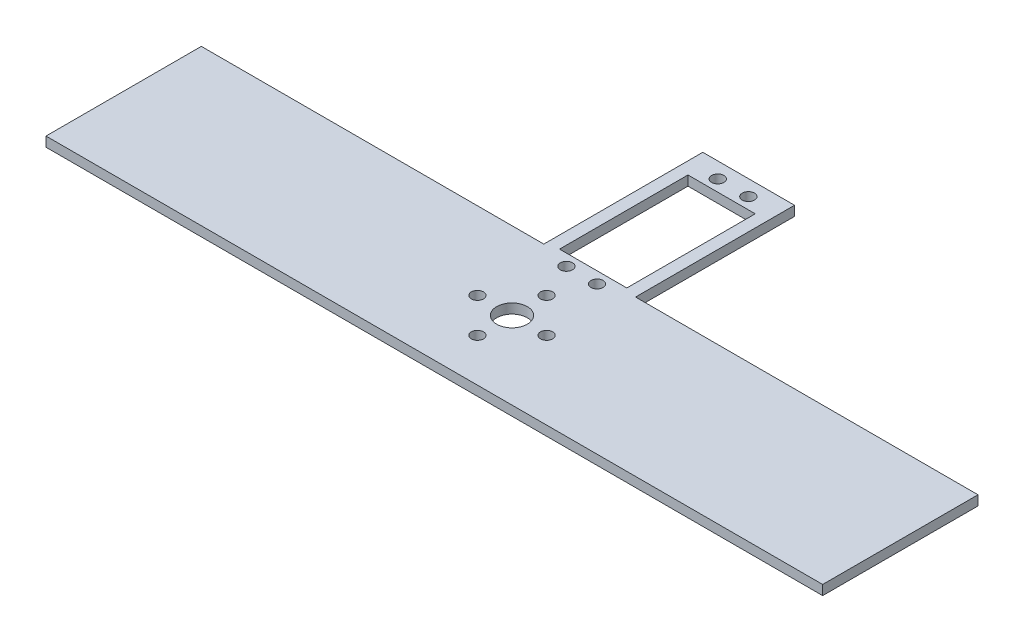
ISO-10303-21;
HEADER;
FILE_DESCRIPTION(('STEP AP214'),'2;1');
FILE_NAME('part.step','',(''),(''),'','','');
FILE_SCHEMA(('AUTOMOTIVE_DESIGN { 1 0 10303 214 1 1 1 1 }'));
ENDSEC;
DATA;
#1=APPLICATION_CONTEXT('core data for automotive mechanical design processes');
#2=APPLICATION_PROTOCOL_DEFINITION('international standard','automotive_design',2000,#1);
#3=PRODUCT_CONTEXT('',#1,'mechanical');
#4=PRODUCT('Part','Part','',(#3));
#5=PRODUCT_RELATED_PRODUCT_CATEGORY('part','',(#4));
#6=PRODUCT_DEFINITION_FORMATION('','',#4);
#7=PRODUCT_DEFINITION_CONTEXT('part definition',#1,'design');
#8=PRODUCT_DEFINITION('design','',#6,#7);
#9=PRODUCT_DEFINITION_SHAPE('','',#8);
#10=(LENGTH_UNIT() NAMED_UNIT(*) SI_UNIT(.MILLI.,.METRE.));
#11=(NAMED_UNIT(*) PLANE_ANGLE_UNIT() SI_UNIT($,.RADIAN.));
#12=(NAMED_UNIT(*) SI_UNIT($,.STERADIAN.) SOLID_ANGLE_UNIT());
#13=UNCERTAINTY_MEASURE_WITH_UNIT(LENGTH_MEASURE(1.E-05),#10,'distance_accuracy_value','');
#14=(GEOMETRIC_REPRESENTATION_CONTEXT(3) GLOBAL_UNCERTAINTY_ASSIGNED_CONTEXT((#13)) GLOBAL_UNIT_ASSIGNED_CONTEXT((#10,
#11,#12)) REPRESENTATION_CONTEXT('',''));
#15=CARTESIAN_POINT('',(0.,0.,0.));
#16=DIRECTION('',(0.,0.,1.));
#17=DIRECTION('',(1.,0.,0.));
#18=AXIS2_PLACEMENT_3D('',#15,#16,#17);
#19=CARTESIAN_POINT('',(0.,3.175,-1.1474067));
#20=DIRECTION('',(0.,0.,-1.));
#21=DIRECTION('',(-1.,0.,0.));
#22=AXIS2_PLACEMENT_3D('',#19,#20,#21);
#23=PLANE('',#22);
#24=DIRECTION('',(1.,0.,0.));
#25=VECTOR('',#24,1.);
#26=CARTESIAN_POINT('',(0.,0.,-1.1474067));
#27=LINE('',#26,#25);
#28=CARTESIAN_POINT('',(116.,0.,-1.1474067));
#29=VERTEX_POINT('',#28);
#30=CARTESIAN_POINT('',(138.,0.,-1.1474067));
#31=VERTEX_POINT('',#30);
#32=EDGE_CURVE('E207',#29,#31,#27,.T.);
#33=ORIENTED_EDGE('',*,*,#32,.F.);
#34=DIRECTION('',(0.,-1.,0.));
#35=VECTOR('',#34,1.);
#36=CARTESIAN_POINT('',(116.,3.175,-1.1474067));
#37=LINE('',#36,#35);
#38=CARTESIAN_POINT('',(116.,3.175,-1.1474067));
#39=VERTEX_POINT('',#38);
#40=EDGE_CURVE('E11',#39,#29,#37,.T.);
#41=ORIENTED_EDGE('',*,*,#40,.F.);
#42=DIRECTION('',(1.,0.,0.));
#43=VECTOR('',#42,1.);
#44=CARTESIAN_POINT('',(0.,3.175,-1.1474067));
#45=LINE('',#44,#43);
#46=CARTESIAN_POINT('',(138.,3.175,-1.1474067));
#47=VERTEX_POINT('',#46);
#48=EDGE_CURVE('E139',#39,#47,#45,.T.);
#49=ORIENTED_EDGE('',*,*,#48,.T.);
#50=DIRECTION('',(0.,-1.,0.));
#51=VECTOR('',#50,1.);
#52=CARTESIAN_POINT('',(138.,3.175,-1.1474067));
#53=LINE('',#52,#51);
#54=EDGE_CURVE('E54',#47,#31,#53,.T.);
#55=ORIENTED_EDGE('',*,*,#54,.T.);
#56=EDGE_LOOP('',(#33,#41,#49,#55));
#57=FACE_BOUND('',#56,.T.);
#58=ADVANCED_FACE('F35',(#57),#23,.T.);
#59=CARTESIAN_POINT('',(116.,3.175,0.));
#60=DIRECTION('',(-1.,0.,0.));
#61=DIRECTION('',(0.,0.,1.));
#62=AXIS2_PLACEMENT_3D('',#59,#60,#61);
#63=PLANE('',#62);
#64=DIRECTION('',(0.,0.,-1.));
#65=VECTOR('',#64,1.);
#66=CARTESIAN_POINT('',(116.,0.,0.));
#67=LINE('',#66,#65);
#68=CARTESIAN_POINT('',(116.,0.,-43.1474067));
#69=VERTEX_POINT('',#68);
#70=EDGE_CURVE('E145',#29,#69,#67,.T.);
#71=ORIENTED_EDGE('',*,*,#70,.T.);
#72=DIRECTION('',(0.,-1.,0.));
#73=VECTOR('',#72,1.);
#74=CARTESIAN_POINT('',(116.,3.175,-43.1474067));
#75=LINE('',#74,#73);
#76=CARTESIAN_POINT('',(116.,3.175,-43.1474067));
#77=VERTEX_POINT('',#76);
#78=EDGE_CURVE('E45',#77,#69,#75,.T.);
#79=ORIENTED_EDGE('',*,*,#78,.F.);
#80=DIRECTION('',(0.,0.,-1.));
#81=VECTOR('',#80,1.);
#82=CARTESIAN_POINT('',(116.,3.175,0.));
#83=LINE('',#82,#81);
#84=EDGE_CURVE('E132',#39,#77,#83,.T.);
#85=ORIENTED_EDGE('',*,*,#84,.F.);
#86=ORIENTED_EDGE('',*,*,#40,.T.);
#87=EDGE_LOOP('',(#71,#79,#85,#86));
#88=FACE_BOUND('',#87,.T.);
#89=ADVANCED_FACE('F143',(#88),#63,.F.);
#90=CARTESIAN_POINT('',(0.,3.175,-43.1474067));
#91=DIRECTION('',(0.,0.,1.));
#92=DIRECTION('',(1.,0.,0.));
#93=AXIS2_PLACEMENT_3D('',#90,#91,#92);
#94=PLANE('',#93);
#95=DIRECTION('',(-1.,0.,0.));
#96=VECTOR('',#95,1.);
#97=CARTESIAN_POINT('',(0.,0.,-43.1474067));
#98=LINE('',#97,#96);
#99=CARTESIAN_POINT('',(138.,0.,-43.1474067));
#100=VERTEX_POINT('',#99);
#101=EDGE_CURVE('E210',#100,#69,#98,.T.);
#102=ORIENTED_EDGE('',*,*,#101,.F.);
#103=DIRECTION('',(0.,-1.,0.));
#104=VECTOR('',#103,1.);
#105=CARTESIAN_POINT('',(138.,3.175,-43.1474067));
#106=LINE('',#105,#104);
#107=CARTESIAN_POINT('',(138.,3.175,-43.1474067));
#108=VERTEX_POINT('',#107);
#109=EDGE_CURVE('E91',#108,#100,#106,.T.);
#110=ORIENTED_EDGE('',*,*,#109,.F.);
#111=DIRECTION('',(-1.,0.,0.));
#112=VECTOR('',#111,1.);
#113=CARTESIAN_POINT('',(0.,3.175,-43.1474067));
#114=LINE('',#113,#112);
#115=EDGE_CURVE('E138',#108,#77,#114,.T.);
#116=ORIENTED_EDGE('',*,*,#115,.T.);
#117=ORIENTED_EDGE('',*,*,#78,.T.);
#118=EDGE_LOOP('',(#102,#110,#116,#117));
#119=FACE_BOUND('',#118,.T.);
#120=ADVANCED_FACE('F149',(#119),#94,.T.);
#121=CARTESIAN_POINT('',(112.,3.175,0.));
#122=DIRECTION('',(-1.,0.,0.));
#123=DIRECTION('',(0.,0.,1.));
#124=AXIS2_PLACEMENT_3D('',#121,#122,#123);
#125=PLANE('',#124);
#126=DIRECTION('',(0.,0.,-1.));
#127=VECTOR('',#126,1.);
#128=CARTESIAN_POINT('',(112.,0.,0.));
#129=LINE('',#128,#127);
#130=CARTESIAN_POINT('',(112.,0.,0.));
#131=VERTEX_POINT('',#130);
#132=CARTESIAN_POINT('',(112.,0.,-52.));
#133=VERTEX_POINT('',#132);
#134=EDGE_CURVE('E165',#131,#133,#129,.T.);
#135=ORIENTED_EDGE('',*,*,#134,.F.);
#136=DIRECTION('',(0.,-1.,0.));
#137=VECTOR('',#136,1.);
#138=CARTESIAN_POINT('',(112.,3.175,0.));
#139=LINE('',#138,#137);
#140=CARTESIAN_POINT('',(112.,3.175,0.));
#141=VERTEX_POINT('',#140);
#142=EDGE_CURVE('E39',#141,#131,#139,.T.);
#143=ORIENTED_EDGE('',*,*,#142,.F.);
#144=DIRECTION('',(0.,0.,-1.));
#145=VECTOR('',#144,1.);
#146=CARTESIAN_POINT('',(112.,3.175,0.));
#147=LINE('',#146,#145);
#148=CARTESIAN_POINT('',(112.,3.175,-52.));
#149=VERTEX_POINT('',#148);
#150=EDGE_CURVE('E262',#141,#149,#147,.T.);
#151=ORIENTED_EDGE('',*,*,#150,.T.);
#152=DIRECTION('',(0.,-1.,0.));
#153=VECTOR('',#152,1.);
#154=CARTESIAN_POINT('',(112.,3.175,-52.));
#155=LINE('',#154,#153);
#156=EDGE_CURVE('E158',#149,#133,#155,.T.);
#157=ORIENTED_EDGE('',*,*,#156,.T.);
#158=EDGE_LOOP('',(#135,#143,#151,#157));
#159=FACE_BOUND('',#158,.T.);
#160=ADVANCED_FACE('F242',(#159),#125,.T.);
#161=CARTESIAN_POINT('',(0.,3.175,0.));
#162=DIRECTION('',(0.,0.,-1.));
#163=DIRECTION('',(-1.,0.,0.));
#164=AXIS2_PLACEMENT_3D('',#161,#162,#163);
#165=PLANE('',#164);
#166=DIRECTION('',(1.,0.,0.));
#167=VECTOR('',#166,1.);
#168=CARTESIAN_POINT('',(0.,0.,0.));
#169=LINE('',#168,#167);
#170=CARTESIAN_POINT('',(0.,0.,0.));
#171=VERTEX_POINT('',#170);
#172=EDGE_CURVE('E168',#171,#131,#169,.T.);
#173=ORIENTED_EDGE('',*,*,#172,.F.);
#174=DIRECTION('',(0.,-1.,0.));
#175=VECTOR('',#174,1.);
#176=CARTESIAN_POINT('',(0.,3.175,0.));
#177=LINE('',#176,#175);
#178=CARTESIAN_POINT('',(0.,3.175,0.));
#179=VERTEX_POINT('',#178);
#180=EDGE_CURVE('E232',#179,#171,#177,.T.);
#181=ORIENTED_EDGE('',*,*,#180,.F.);
#182=DIRECTION('',(1.,0.,0.));
#183=VECTOR('',#182,1.);
#184=CARTESIAN_POINT('',(0.,3.175,0.));
#185=LINE('',#184,#183);
#186=EDGE_CURVE('E241',#179,#141,#185,.T.);
#187=ORIENTED_EDGE('',*,*,#186,.T.);
#188=ORIENTED_EDGE('',*,*,#142,.T.);
#189=EDGE_LOOP('',(#173,#181,#187,#188));
#190=FACE_BOUND('',#189,.T.);
#191=ADVANCED_FACE('F239',(#190),#165,.T.);
#192=CARTESIAN_POINT('',(0.,3.175,0.));
#193=DIRECTION('',(1.,0.,0.));
#194=DIRECTION('',(0.,0.,-1.));
#195=AXIS2_PLACEMENT_3D('',#192,#193,#194);
#196=PLANE('',#195);
#197=DIRECTION('',(0.,0.,1.));
#198=VECTOR('',#197,1.);
#199=CARTESIAN_POINT('',(0.,0.,0.));
#200=LINE('',#199,#198);
#201=CARTESIAN_POINT('',(0.,0.,50.8));
#202=VERTEX_POINT('',#201);
#203=EDGE_CURVE('E171',#171,#202,#200,.T.);
#204=ORIENTED_EDGE('',*,*,#203,.T.);
#205=DIRECTION('',(0.,-1.,0.));
#206=VECTOR('',#205,1.);
#207=CARTESIAN_POINT('',(0.,3.175,50.8));
#208=LINE('',#207,#206);
#209=CARTESIAN_POINT('',(0.,3.175,50.8));
#210=VERTEX_POINT('',#209);
#211=EDGE_CURVE('E230',#210,#202,#208,.T.);
#212=ORIENTED_EDGE('',*,*,#211,.F.);
#213=DIRECTION('',(0.,0.,1.));
#214=VECTOR('',#213,1.);
#215=CARTESIAN_POINT('',(0.,3.175,0.));
#216=LINE('',#215,#214);
#217=EDGE_CURVE('E250',#179,#210,#216,.T.);
#218=ORIENTED_EDGE('',*,*,#217,.F.);
#219=ORIENTED_EDGE('',*,*,#180,.T.);
#220=EDGE_LOOP('',(#204,#212,#218,#219));
#221=FACE_BOUND('',#220,.T.);
#222=ADVANCED_FACE('F248',(#221),#196,.F.);
#223=CARTESIAN_POINT('',(0.,3.175,50.8));
#224=DIRECTION('',(0.,0.,-1.));
#225=DIRECTION('',(-1.,0.,0.));
#226=AXIS2_PLACEMENT_3D('',#223,#224,#225);
#227=PLANE('',#226);
#228=DIRECTION('',(1.,0.,0.));
#229=VECTOR('',#228,1.);
#230=CARTESIAN_POINT('',(0.,0.,50.8));
#231=LINE('',#230,#229);
#232=CARTESIAN_POINT('',(254.,0.,50.8));
#233=VERTEX_POINT('',#232);
#234=EDGE_CURVE('E174',#202,#233,#231,.T.);
#235=ORIENTED_EDGE('',*,*,#234,.T.);
#236=DIRECTION('',(0.,-1.,0.));
#237=VECTOR('',#236,1.);
#238=CARTESIAN_POINT('',(254.,3.175,50.8));
#239=LINE('',#238,#237);
#240=CARTESIAN_POINT('',(254.,3.175,50.8));
#241=VERTEX_POINT('',#240);
#242=EDGE_CURVE('E228',#241,#233,#239,.T.);
#243=ORIENTED_EDGE('',*,*,#242,.F.);
#244=DIRECTION('',(1.,0.,0.));
#245=VECTOR('',#244,1.);
#246=CARTESIAN_POINT('',(0.,3.175,50.8));
#247=LINE('',#246,#245);
#248=EDGE_CURVE('E254',#210,#241,#247,.T.);
#249=ORIENTED_EDGE('',*,*,#248,.F.);
#250=ORIENTED_EDGE('',*,*,#211,.T.);
#251=EDGE_LOOP('',(#235,#243,#249,#250));
#252=FACE_BOUND('',#251,.T.);
#253=ADVANCED_FACE('F252',(#252),#227,.F.);
#254=CARTESIAN_POINT('',(254.,3.175,0.));
#255=DIRECTION('',(1.,0.,0.));
#256=DIRECTION('',(0.,0.,-1.));
#257=AXIS2_PLACEMENT_3D('',#254,#255,#256);
#258=PLANE('',#257);
#259=DIRECTION('',(0.,0.,1.));
#260=VECTOR('',#259,1.);
#261=CARTESIAN_POINT('',(254.,0.,0.));
#262=LINE('',#261,#260);
#263=CARTESIAN_POINT('',(254.,0.,0.));
#264=VERTEX_POINT('',#263);
#265=EDGE_CURVE('E177',#264,#233,#262,.T.);
#266=ORIENTED_EDGE('',*,*,#265,.F.);
#267=DIRECTION('',(0.,-1.,0.));
#268=VECTOR('',#267,1.);
#269=CARTESIAN_POINT('',(254.,3.175,0.));
#270=LINE('',#269,#268);
#271=CARTESIAN_POINT('',(254.,3.175,0.));
#272=VERTEX_POINT('',#271);
#273=EDGE_CURVE('E226',#272,#264,#270,.T.);
#274=ORIENTED_EDGE('',*,*,#273,.F.);
#275=DIRECTION('',(0.,0.,1.));
#276=VECTOR('',#275,1.);
#277=CARTESIAN_POINT('',(254.,3.175,0.));
#278=LINE('',#277,#276);
#279=EDGE_CURVE('E258',#272,#241,#278,.T.);
#280=ORIENTED_EDGE('',*,*,#279,.T.);
#281=ORIENTED_EDGE('',*,*,#242,.T.);
#282=EDGE_LOOP('',(#266,#274,#280,#281));
#283=FACE_BOUND('',#282,.T.);
#284=ADVANCED_FACE('F343',(#283),#258,.T.);
#285=CARTESIAN_POINT('',(0.,3.175,0.));
#286=DIRECTION('',(0.,0.,-1.));
#287=DIRECTION('',(-1.,0.,0.));
#288=AXIS2_PLACEMENT_3D('',#285,#286,#287);
#289=PLANE('',#288);
#290=DIRECTION('',(1.,0.,0.));
#291=VECTOR('',#290,1.);
#292=CARTESIAN_POINT('',(0.,0.,0.));
#293=LINE('',#292,#291);
#294=CARTESIAN_POINT('',(142.,0.,0.));
#295=VERTEX_POINT('',#294);
#296=EDGE_CURVE('E180',#295,#264,#293,.T.);
#297=ORIENTED_EDGE('',*,*,#296,.F.);
#298=DIRECTION('',(0.,-1.,0.));
#299=VECTOR('',#298,1.);
#300=CARTESIAN_POINT('',(142.,3.175,0.));
#301=LINE('',#300,#299);
#302=CARTESIAN_POINT('',(142.,3.175,0.));
#303=VERTEX_POINT('',#302);
#304=EDGE_CURVE('E224',#303,#295,#301,.T.);
#305=ORIENTED_EDGE('',*,*,#304,.F.);
#306=DIRECTION('',(1.,0.,0.));
#307=VECTOR('',#306,1.);
#308=CARTESIAN_POINT('',(0.,3.175,0.));
#309=LINE('',#308,#307);
#310=EDGE_CURVE('E267',#303,#272,#309,.T.);
#311=ORIENTED_EDGE('',*,*,#310,.T.);
#312=ORIENTED_EDGE('',*,*,#273,.T.);
#313=EDGE_LOOP('',(#297,#305,#311,#312));
#314=FACE_BOUND('',#313,.T.);
#315=ADVANCED_FACE('F305',(#314),#289,.T.);
#316=CARTESIAN_POINT('',(142.,3.175,0.));
#317=DIRECTION('',(1.,0.,0.));
#318=DIRECTION('',(0.,0.,-1.));
#319=AXIS2_PLACEMENT_3D('',#316,#317,#318);
#320=PLANE('',#319);
#321=DIRECTION('',(0.,0.,1.));
#322=VECTOR('',#321,1.);
#323=CARTESIAN_POINT('',(142.,0.,0.));
#324=LINE('',#323,#322);
#325=CARTESIAN_POINT('',(142.,0.,-52.));
#326=VERTEX_POINT('',#325);
#327=EDGE_CURVE('E183',#326,#295,#324,.T.);
#328=ORIENTED_EDGE('',*,*,#327,.F.);
#329=DIRECTION('',(0.,-1.,0.));
#330=VECTOR('',#329,1.);
#331=CARTESIAN_POINT('',(142.,3.175,-52.));
#332=LINE('',#331,#330);
#333=CARTESIAN_POINT('',(142.,3.175,-52.));
#334=VERTEX_POINT('',#333);
#335=EDGE_CURVE('E222',#334,#326,#332,.T.);
#336=ORIENTED_EDGE('',*,*,#335,.F.);
#337=DIRECTION('',(0.,0.,1.));
#338=VECTOR('',#337,1.);
#339=CARTESIAN_POINT('',(142.,3.175,0.));
#340=LINE('',#339,#338);
#341=EDGE_CURVE('E270',#334,#303,#340,.T.);
#342=ORIENTED_EDGE('',*,*,#341,.T.);
#343=ORIENTED_EDGE('',*,*,#304,.T.);
#344=EDGE_LOOP('',(#328,#336,#342,#343));
#345=FACE_BOUND('',#344,.T.);
#346=ADVANCED_FACE('F296',(#345),#320,.T.);
#347=CARTESIAN_POINT('',(138.,3.175,0.));
#348=DIRECTION('',(-1.,0.,0.));
#349=DIRECTION('',(0.,0.,1.));
#350=AXIS2_PLACEMENT_3D('',#347,#348,#349);
#351=PLANE('',#350);
#352=DIRECTION('',(0.,0.,-1.));
#353=VECTOR('',#352,1.);
#354=CARTESIAN_POINT('',(138.,0.,0.));
#355=LINE('',#354,#353);
#356=EDGE_CURVE('E212',#31,#100,#355,.T.);
#357=ORIENTED_EDGE('',*,*,#356,.F.);
#358=ORIENTED_EDGE('',*,*,#54,.F.);
#359=DIRECTION('',(0.,0.,-1.));
#360=VECTOR('',#359,1.);
#361=CARTESIAN_POINT('',(138.,3.175,0.));
#362=LINE('',#361,#360);
#363=EDGE_CURVE('E150',#47,#108,#362,.T.);
#364=ORIENTED_EDGE('',*,*,#363,.T.);
#365=ORIENTED_EDGE('',*,*,#109,.T.);
#366=EDGE_LOOP('',(#357,#358,#364,#365));
#367=FACE_BOUND('',#366,.T.);
#368=ADVANCED_FACE('F293',(#367),#351,.T.);
#369=CARTESIAN_POINT('',(132.,3.175,-46.8974067));
#370=DIRECTION('',(0.,-1.,0.));
#371=DIRECTION('',(0.,0.,-1.));
#372=AXIS2_PLACEMENT_3D('',#369,#370,#371);
#373=CYLINDRICAL_SURFACE('',#372,2.);
#374=CARTESIAN_POINT('',(132.,3.175,-46.8974067));
#375=DIRECTION('',(0.,1.,0.));
#376=DIRECTION('',(0.,0.,1.));
#377=AXIS2_PLACEMENT_3D('',#374,#375,#376);
#378=CIRCLE('',#377,2.);
#379=CARTESIAN_POINT('',(132.,3.175,-44.8974067));
#380=VERTEX_POINT('',#379);
#381=EDGE_CURVE('E291',#380,#380,#378,.T.);
#382=ORIENTED_EDGE('',*,*,#381,.T.);
#383=EDGE_LOOP('',(#382));
#384=FACE_BOUND('',#383,.T.);
#385=CARTESIAN_POINT('',(132.,0.,-46.8974067));
#386=DIRECTION('',(0.,1.,0.));
#387=DIRECTION('',(0.,0.,1.));
#388=AXIS2_PLACEMENT_3D('',#385,#386,#387);
#389=CIRCLE('',#388,2.);
#390=CARTESIAN_POINT('',(132.,0.,-44.8974067));
#391=VERTEX_POINT('',#390);
#392=EDGE_CURVE('E204',#391,#391,#389,.T.);
#393=ORIENTED_EDGE('',*,*,#392,.F.);
#394=EDGE_LOOP('',(#393));
#395=FACE_BOUND('',#394,.T.);
#396=ADVANCED_FACE('F295',(#384,#395),#373,.F.);
#397=CARTESIAN_POINT('',(122.,3.175,2.6025933));
#398=DIRECTION('',(0.,-1.,0.));
#399=DIRECTION('',(0.,0.,-1.));
#400=AXIS2_PLACEMENT_3D('',#397,#398,#399);
#401=CYLINDRICAL_SURFACE('',#400,2.);
#402=CARTESIAN_POINT('',(122.,3.175,2.6025933));
#403=DIRECTION('',(0.,1.,0.));
#404=DIRECTION('',(0.,0.,1.));
#405=AXIS2_PLACEMENT_3D('',#402,#403,#404);
#406=CIRCLE('',#405,2.);
#407=CARTESIAN_POINT('',(122.,3.175,4.6025933));
#408=VERTEX_POINT('',#407);
#409=EDGE_CURVE('E288',#408,#408,#406,.T.);
#410=ORIENTED_EDGE('',*,*,#409,.T.);
#411=EDGE_LOOP('',(#410));
#412=FACE_BOUND('',#411,.T.);
#413=CARTESIAN_POINT('',(122.,0.,2.6025933));
#414=DIRECTION('',(0.,1.,0.));
#415=DIRECTION('',(0.,0.,1.));
#416=AXIS2_PLACEMENT_3D('',#413,#414,#415);
#417=CIRCLE('',#416,2.);
#418=CARTESIAN_POINT('',(122.,0.,4.6025933));
#419=VERTEX_POINT('',#418);
#420=EDGE_CURVE('E201',#419,#419,#417,.T.);
#421=ORIENTED_EDGE('',*,*,#420,.F.);
#422=EDGE_LOOP('',(#421));
#423=FACE_BOUND('',#422,.T.);
#424=ADVANCED_FACE('F302',(#412,#423),#401,.F.);
#425=CARTESIAN_POINT('',(132.,3.175,2.6025933));
#426=DIRECTION('',(0.,-1.,0.));
#427=DIRECTION('',(0.,0.,-1.));
#428=AXIS2_PLACEMENT_3D('',#425,#426,#427);
#429=CYLINDRICAL_SURFACE('',#428,2.);
#430=CARTESIAN_POINT('',(132.,3.175,2.6025933));
#431=DIRECTION('',(0.,1.,0.));
#432=DIRECTION('',(0.,0.,1.));
#433=AXIS2_PLACEMENT_3D('',#430,#431,#432);
#434=CIRCLE('',#433,2.);
#435=CARTESIAN_POINT('',(132.,3.175,4.6025933));
#436=VERTEX_POINT('',#435);
#437=EDGE_CURVE('E285',#436,#436,#434,.T.);
#438=ORIENTED_EDGE('',*,*,#437,.T.);
#439=EDGE_LOOP('',(#438));
#440=FACE_BOUND('',#439,.T.);
#441=CARTESIAN_POINT('',(132.,0.,2.6025933));
#442=DIRECTION('',(0.,1.,0.));
#443=DIRECTION('',(0.,0.,1.));
#444=AXIS2_PLACEMENT_3D('',#441,#442,#443);
#445=CIRCLE('',#444,2.);
#446=CARTESIAN_POINT('',(132.,0.,4.6025933));
#447=VERTEX_POINT('',#446);
#448=EDGE_CURVE('E198',#447,#447,#445,.T.);
#449=ORIENTED_EDGE('',*,*,#448,.F.);
#450=EDGE_LOOP('',(#449));
#451=FACE_BOUND('',#450,.T.);
#452=ADVANCED_FACE('F319',(#440,#451),#429,.F.);
#453=CARTESIAN_POINT('',(127.,3.175,36.7137084989848));
#454=DIRECTION('',(0.,-1.,0.));
#455=DIRECTION('',(0.,0.,-1.));
#456=AXIS2_PLACEMENT_3D('',#453,#454,#455);
#457=CYLINDRICAL_SURFACE('',#456,2.);
#458=CARTESIAN_POINT('',(127.,3.175,36.7137084989848));
#459=DIRECTION('',(0.,1.,0.));
#460=DIRECTION('',(0.,0.,1.));
#461=AXIS2_PLACEMENT_3D('',#458,#459,#460);
#462=CIRCLE('',#461,2.);
#463=CARTESIAN_POINT('',(127.,3.175,38.7137084989848));
#464=VERTEX_POINT('',#463);
#465=EDGE_CURVE('E282',#464,#464,#462,.T.);
#466=ORIENTED_EDGE('',*,*,#465,.T.);
#467=EDGE_LOOP('',(#466));
#468=FACE_BOUND('',#467,.T.);
#469=CARTESIAN_POINT('',(127.,0.,36.7137084989848));
#470=DIRECTION('',(0.,1.,0.));
#471=DIRECTION('',(0.,0.,1.));
#472=AXIS2_PLACEMENT_3D('',#469,#470,#471);
#473=CIRCLE('',#472,2.);
#474=CARTESIAN_POINT('',(127.,0.,38.7137084989848));
#475=VERTEX_POINT('',#474);
#476=EDGE_CURVE('E195',#475,#475,#473,.T.);
#477=ORIENTED_EDGE('',*,*,#476,.F.);
#478=EDGE_LOOP('',(#477));
#479=FACE_BOUND('',#478,.T.);
#480=ADVANCED_FACE('F323',(#468,#479),#457,.F.);
#481=CARTESIAN_POINT('',(138.313708498985,3.175,25.4));
#482=DIRECTION('',(0.,-1.,0.));
#483=DIRECTION('',(0.,0.,-1.));
#484=AXIS2_PLACEMENT_3D('',#481,#482,#483);
#485=CYLINDRICAL_SURFACE('',#484,2.);
#486=CARTESIAN_POINT('',(138.313708498985,3.175,25.4));
#487=DIRECTION('',(0.,1.,0.));
#488=DIRECTION('',(0.,0.,1.));
#489=AXIS2_PLACEMENT_3D('',#486,#487,#488);
#490=CIRCLE('',#489,2.);
#491=CARTESIAN_POINT('',(138.313708498985,3.175,27.4));
#492=VERTEX_POINT('',#491);
#493=EDGE_CURVE('E279',#492,#492,#490,.T.);
#494=ORIENTED_EDGE('',*,*,#493,.T.);
#495=EDGE_LOOP('',(#494));
#496=FACE_BOUND('',#495,.T.);
#497=CARTESIAN_POINT('',(138.313708498985,0.,25.4));
#498=DIRECTION('',(0.,1.,0.));
#499=DIRECTION('',(0.,0.,1.));
#500=AXIS2_PLACEMENT_3D('',#497,#498,#499);
#501=CIRCLE('',#500,2.);
#502=CARTESIAN_POINT('',(138.313708498985,0.,27.4));
#503=VERTEX_POINT('',#502);
#504=EDGE_CURVE('E192',#503,#503,#501,.T.);
#505=ORIENTED_EDGE('',*,*,#504,.F.);
#506=EDGE_LOOP('',(#505));
#507=FACE_BOUND('',#506,.T.);
#508=ADVANCED_FACE('F327',(#496,#507),#485,.F.);
#509=CARTESIAN_POINT('',(127.,3.175,25.4));
#510=DIRECTION('',(0.,-1.,0.));
#511=DIRECTION('',(0.,0.,-1.));
#512=AXIS2_PLACEMENT_3D('',#509,#510,#511);
#513=CYLINDRICAL_SURFACE('',#512,4.99999999999999);
#514=CARTESIAN_POINT('',(127.,3.175,25.4));
#515=DIRECTION('',(0.,1.,0.));
#516=DIRECTION('',(0.,0.,1.));
#517=AXIS2_PLACEMENT_3D('',#514,#515,#516);
#518=CIRCLE('',#517,4.99999999999999);
#519=CARTESIAN_POINT('',(127.,3.175,30.4));
#520=VERTEX_POINT('',#519);
#521=EDGE_CURVE('E276',#520,#520,#518,.T.);
#522=ORIENTED_EDGE('',*,*,#521,.T.);
#523=EDGE_LOOP('',(#522));
#524=FACE_BOUND('',#523,.T.);
#525=CARTESIAN_POINT('',(127.,0.,25.4));
#526=DIRECTION('',(0.,1.,0.));
#527=DIRECTION('',(0.,0.,1.));
#528=AXIS2_PLACEMENT_3D('',#525,#526,#527);
#529=CIRCLE('',#528,4.99999999999999);
#530=CARTESIAN_POINT('',(127.,0.,30.4));
#531=VERTEX_POINT('',#530);
#532=EDGE_CURVE('E189',#531,#531,#529,.T.);
#533=ORIENTED_EDGE('',*,*,#532,.F.);
#534=EDGE_LOOP('',(#533));
#535=FACE_BOUND('',#534,.T.);
#536=ADVANCED_FACE('F331',(#524,#535),#513,.F.);
#537=CARTESIAN_POINT('',(0.,3.175,-52.));
#538=DIRECTION('',(0.,0.,-1.));
#539=DIRECTION('',(-1.,0.,0.));
#540=AXIS2_PLACEMENT_3D('',#537,#538,#539);
#541=PLANE('',#540);
#542=DIRECTION('',(1.,0.,0.));
#543=VECTOR('',#542,1.);
#544=CARTESIAN_POINT('',(0.,0.,-52.));
#545=LINE('',#544,#543);
#546=EDGE_CURVE('E186',#133,#326,#545,.T.);
#547=ORIENTED_EDGE('',*,*,#546,.F.);
#548=ORIENTED_EDGE('',*,*,#156,.F.);
#549=DIRECTION('',(1.,0.,0.));
#550=VECTOR('',#549,1.);
#551=CARTESIAN_POINT('',(0.,3.175,-52.));
#552=LINE('',#551,#550);
#553=EDGE_CURVE('E273',#149,#334,#552,.T.);
#554=ORIENTED_EDGE('',*,*,#553,.T.);
#555=ORIENTED_EDGE('',*,*,#335,.T.);
#556=EDGE_LOOP('',(#547,#548,#554,#555));
#557=FACE_BOUND('',#556,.T.);
#558=ADVANCED_FACE('F335',(#557),#541,.T.);
#559=CARTESIAN_POINT('',(115.686291501015,3.175,25.4));
#560=DIRECTION('',(0.,-1.,0.));
#561=DIRECTION('',(0.,0.,-1.));
#562=AXIS2_PLACEMENT_3D('',#559,#560,#561);
#563=CYLINDRICAL_SURFACE('',#562,2.);
#564=CARTESIAN_POINT('',(115.686291501015,3.175,25.4));
#565=DIRECTION('',(0.,1.,0.));
#566=DIRECTION('',(0.,0.,1.));
#567=AXIS2_PLACEMENT_3D('',#564,#565,#566);
#568=CIRCLE('',#567,2.);
#569=CARTESIAN_POINT('',(115.686291501015,3.175,27.4));
#570=VERTEX_POINT('',#569);
#571=EDGE_CURVE('E365',#570,#570,#568,.T.);
#572=ORIENTED_EDGE('',*,*,#571,.T.);
#573=EDGE_LOOP('',(#572));
#574=FACE_BOUND('',#573,.T.);
#575=CARTESIAN_POINT('',(115.686291501015,0.,25.4));
#576=DIRECTION('',(0.,1.,0.));
#577=DIRECTION('',(0.,0.,1.));
#578=AXIS2_PLACEMENT_3D('',#575,#576,#577);
#579=CIRCLE('',#578,2.);
#580=CARTESIAN_POINT('',(115.686291501015,0.,27.4));
#581=VERTEX_POINT('',#580);
#582=EDGE_CURVE('E162',#581,#581,#579,.T.);
#583=ORIENTED_EDGE('',*,*,#582,.F.);
#584=EDGE_LOOP('',(#583));
#585=FACE_BOUND('',#584,.T.);
#586=ADVANCED_FACE('F338',(#574,#585),#563,.F.);
#587=CARTESIAN_POINT('',(127.,3.175,14.0862915010152));
#588=DIRECTION('',(0.,-1.,0.));
#589=DIRECTION('',(0.,0.,-1.));
#590=AXIS2_PLACEMENT_3D('',#587,#588,#589);
#591=CYLINDRICAL_SURFACE('',#590,2.);
#592=CARTESIAN_POINT('',(127.,3.175,14.0862915010152));
#593=DIRECTION('',(0.,1.,0.));
#594=DIRECTION('',(0.,0.,1.));
#595=AXIS2_PLACEMENT_3D('',#592,#593,#594);
#596=CIRCLE('',#595,2.);
#597=CARTESIAN_POINT('',(127.,3.175,16.0862915010152));
#598=VERTEX_POINT('',#597);
#599=EDGE_CURVE('E218',#598,#598,#596,.T.);
#600=ORIENTED_EDGE('',*,*,#599,.T.);
#601=EDGE_LOOP('',(#600));
#602=FACE_BOUND('',#601,.T.);
#603=CARTESIAN_POINT('',(127.,0.,14.0862915010152));
#604=DIRECTION('',(0.,1.,0.));
#605=DIRECTION('',(0.,0.,1.));
#606=AXIS2_PLACEMENT_3D('',#603,#604,#605);
#607=CIRCLE('',#606,2.);
#608=CARTESIAN_POINT('',(127.,0.,16.0862915010152));
#609=VERTEX_POINT('',#608);
#610=EDGE_CURVE('E159',#609,#609,#607,.T.);
#611=ORIENTED_EDGE('',*,*,#610,.F.);
#612=EDGE_LOOP('',(#611));
#613=FACE_BOUND('',#612,.T.);
#614=ADVANCED_FACE('F37',(#602,#613),#591,.F.);
#615=CARTESIAN_POINT('',(122.,3.175,-46.8974067));
#616=DIRECTION('',(0.,-1.,0.));
#617=DIRECTION('',(0.,0.,-1.));
#618=AXIS2_PLACEMENT_3D('',#615,#616,#617);
#619=CYLINDRICAL_SURFACE('',#618,2.);
#620=CARTESIAN_POINT('',(122.,3.175,-46.8974067));
#621=DIRECTION('',(0.,1.,0.));
#622=DIRECTION('',(0.,0.,1.));
#623=AXIS2_PLACEMENT_3D('',#620,#621,#622);
#624=CIRCLE('',#623,2.);
#625=CARTESIAN_POINT('',(122.,3.175,-44.8974067));
#626=VERTEX_POINT('',#625);
#627=EDGE_CURVE('E152',#626,#626,#624,.T.);
#628=ORIENTED_EDGE('',*,*,#627,.T.);
#629=EDGE_LOOP('',(#628));
#630=FACE_BOUND('',#629,.T.);
#631=CARTESIAN_POINT('',(122.,0.,-46.8974067));
#632=DIRECTION('',(0.,1.,0.));
#633=DIRECTION('',(0.,0.,1.));
#634=AXIS2_PLACEMENT_3D('',#631,#632,#633);
#635=CIRCLE('',#634,2.);
#636=CARTESIAN_POINT('',(122.,0.,-44.8974067));
#637=VERTEX_POINT('',#636);
#638=EDGE_CURVE('E215',#637,#637,#635,.T.);
#639=ORIENTED_EDGE('',*,*,#638,.F.);
#640=EDGE_LOOP('',(#639));
#641=FACE_BOUND('',#640,.T.);
#642=ADVANCED_FACE('F360',(#630,#641),#619,.F.);
#643=CARTESIAN_POINT('',(0.,3.175,0.));
#644=DIRECTION('',(0.,1.,0.));
#645=DIRECTION('',(0.,0.,1.));
#646=AXIS2_PLACEMENT_3D('',#643,#644,#645);
#647=PLANE('',#646);
#648=ORIENTED_EDGE('',*,*,#599,.F.);
#649=EDGE_LOOP('',(#648));
#650=FACE_BOUND('',#649,.T.);
#651=ORIENTED_EDGE('',*,*,#571,.F.);
#652=EDGE_LOOP('',(#651));
#653=FACE_BOUND('',#652,.T.);
#654=ORIENTED_EDGE('',*,*,#150,.F.);
#655=ORIENTED_EDGE('',*,*,#186,.F.);
#656=ORIENTED_EDGE('',*,*,#217,.T.);
#657=ORIENTED_EDGE('',*,*,#248,.T.);
#658=ORIENTED_EDGE('',*,*,#279,.F.);
#659=ORIENTED_EDGE('',*,*,#310,.F.);
#660=ORIENTED_EDGE('',*,*,#341,.F.);
#661=ORIENTED_EDGE('',*,*,#553,.F.);
#662=EDGE_LOOP('',(#654,#655,#656,#657,#658,#659,#660,#661));
#663=FACE_BOUND('',#662,.T.);
#664=ORIENTED_EDGE('',*,*,#521,.F.);
#665=EDGE_LOOP('',(#664));
#666=FACE_BOUND('',#665,.T.);
#667=ORIENTED_EDGE('',*,*,#493,.F.);
#668=EDGE_LOOP('',(#667));
#669=FACE_BOUND('',#668,.T.);
#670=ORIENTED_EDGE('',*,*,#465,.F.);
#671=EDGE_LOOP('',(#670));
#672=FACE_BOUND('',#671,.T.);
#673=ORIENTED_EDGE('',*,*,#437,.F.);
#674=EDGE_LOOP('',(#673));
#675=FACE_BOUND('',#674,.T.);
#676=ORIENTED_EDGE('',*,*,#409,.F.);
#677=EDGE_LOOP('',(#676));
#678=FACE_BOUND('',#677,.T.);
#679=ORIENTED_EDGE('',*,*,#381,.F.);
#680=EDGE_LOOP('',(#679));
#681=FACE_BOUND('',#680,.T.);
#682=ORIENTED_EDGE('',*,*,#48,.F.);
#683=ORIENTED_EDGE('',*,*,#84,.T.);
#684=ORIENTED_EDGE('',*,*,#115,.F.);
#685=ORIENTED_EDGE('',*,*,#363,.F.);
#686=EDGE_LOOP('',(#682,#683,#684,#685));
#687=FACE_BOUND('',#686,.T.);
#688=ORIENTED_EDGE('',*,*,#627,.F.);
#689=EDGE_LOOP('',(#688));
#690=FACE_BOUND('',#689,.T.);
#691=ADVANCED_FACE('F134',(#650,#653,#663,#666,#669,#672,#675,#678,#681,#687,#690),#647,.T.);
#692=CARTESIAN_POINT('',(0.,0.,0.));
#693=DIRECTION('',(0.,1.,0.));
#694=DIRECTION('',(0.,0.,1.));
#695=AXIS2_PLACEMENT_3D('',#692,#693,#694);
#696=PLANE('',#695);
#697=ORIENTED_EDGE('',*,*,#610,.T.);
#698=EDGE_LOOP('',(#697));
#699=FACE_BOUND('',#698,.T.);
#700=ORIENTED_EDGE('',*,*,#582,.T.);
#701=EDGE_LOOP('',(#700));
#702=FACE_BOUND('',#701,.T.);
#703=ORIENTED_EDGE('',*,*,#134,.T.);
#704=ORIENTED_EDGE('',*,*,#546,.T.);
#705=ORIENTED_EDGE('',*,*,#327,.T.);
#706=ORIENTED_EDGE('',*,*,#296,.T.);
#707=ORIENTED_EDGE('',*,*,#265,.T.);
#708=ORIENTED_EDGE('',*,*,#234,.F.);
#709=ORIENTED_EDGE('',*,*,#203,.F.);
#710=ORIENTED_EDGE('',*,*,#172,.T.);
#711=EDGE_LOOP('',(#703,#704,#705,#706,#707,#708,#709,#710));
#712=FACE_BOUND('',#711,.T.);
#713=ORIENTED_EDGE('',*,*,#532,.T.);
#714=EDGE_LOOP('',(#713));
#715=FACE_BOUND('',#714,.T.);
#716=ORIENTED_EDGE('',*,*,#504,.T.);
#717=EDGE_LOOP('',(#716));
#718=FACE_BOUND('',#717,.T.);
#719=ORIENTED_EDGE('',*,*,#476,.T.);
#720=EDGE_LOOP('',(#719));
#721=FACE_BOUND('',#720,.T.);
#722=ORIENTED_EDGE('',*,*,#448,.T.);
#723=EDGE_LOOP('',(#722));
#724=FACE_BOUND('',#723,.T.);
#725=ORIENTED_EDGE('',*,*,#420,.T.);
#726=EDGE_LOOP('',(#725));
#727=FACE_BOUND('',#726,.T.);
#728=ORIENTED_EDGE('',*,*,#392,.T.);
#729=EDGE_LOOP('',(#728));
#730=FACE_BOUND('',#729,.T.);
#731=ORIENTED_EDGE('',*,*,#32,.T.);
#732=ORIENTED_EDGE('',*,*,#356,.T.);
#733=ORIENTED_EDGE('',*,*,#101,.T.);
#734=ORIENTED_EDGE('',*,*,#70,.F.);
#735=EDGE_LOOP('',(#731,#732,#733,#734));
#736=FACE_BOUND('',#735,.T.);
#737=ORIENTED_EDGE('',*,*,#638,.T.);
#738=EDGE_LOOP('',(#737));
#739=FACE_BOUND('',#738,.T.);
#740=ADVANCED_FACE('F245',(#699,#702,#712,#715,#718,#721,#724,#727,#730,#736,#739),#696,.F.);
#741=CLOSED_SHELL('',(#58,#89,#120,#160,#191,#222,#253,#284,#315,#346,#368,#396,#424,#452,#480,
#508,#536,#558,#586,#614,#642,#691,#740));
#742=MANIFOLD_SOLID_BREP('B2',#741);
#743=ADVANCED_BREP_SHAPE_REPRESENTATION('',(#18,#742),#14);
#744=SHAPE_DEFINITION_REPRESENTATION(#9,#743);
ENDSEC;
END-ISO-10303-21;
